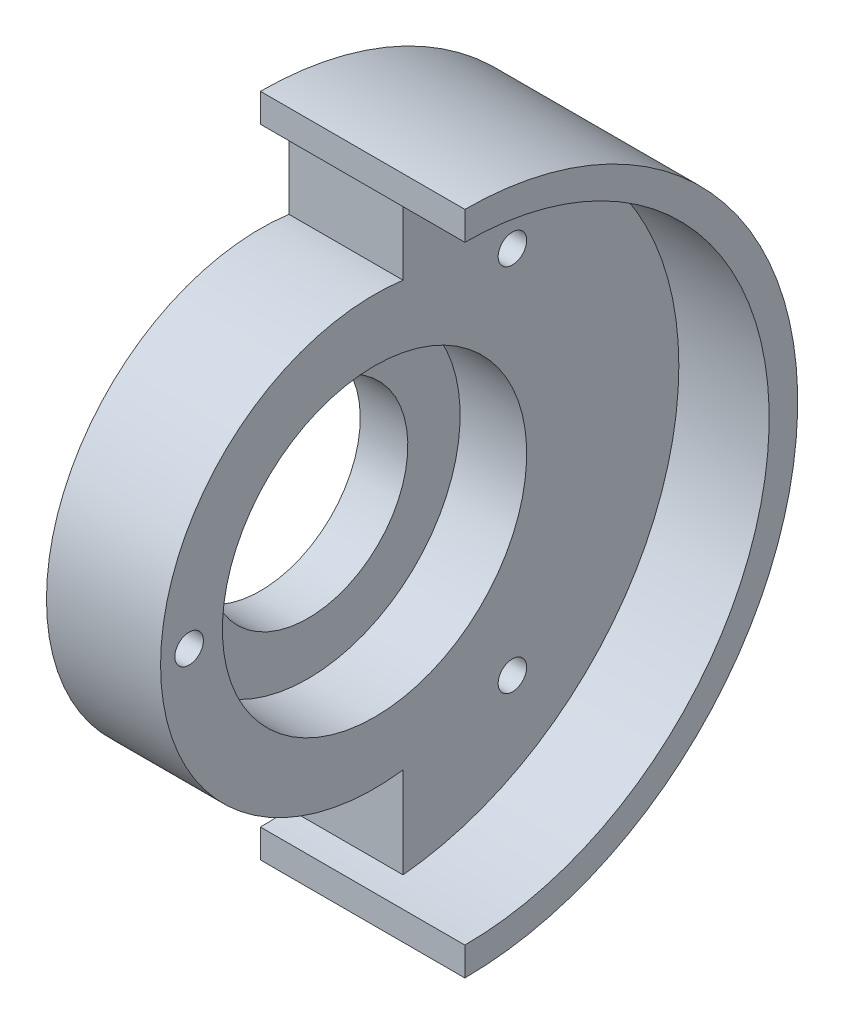
ISO-10303-21;
HEADER;
FILE_DESCRIPTION(('STEP AP214'),'2;1');
FILE_NAME('part.step','',(''),(''),'','','');
FILE_SCHEMA(('AUTOMOTIVE_DESIGN { 1 0 10303 214 1 1 1 1 }'));
ENDSEC;
DATA;
#1=APPLICATION_CONTEXT('core data for automotive mechanical design processes');
#2=APPLICATION_PROTOCOL_DEFINITION('international standard','automotive_design',2000,#1);
#3=PRODUCT_CONTEXT('',#1,'mechanical');
#4=PRODUCT('Part','Part','',(#3));
#5=PRODUCT_RELATED_PRODUCT_CATEGORY('part','',(#4));
#6=PRODUCT_DEFINITION_FORMATION('','',#4);
#7=PRODUCT_DEFINITION_CONTEXT('part definition',#1,'design');
#8=PRODUCT_DEFINITION('design','',#6,#7);
#9=PRODUCT_DEFINITION_SHAPE('','',#8);
#10=(LENGTH_UNIT() NAMED_UNIT(*) SI_UNIT(.MILLI.,.METRE.));
#11=(NAMED_UNIT(*) PLANE_ANGLE_UNIT() SI_UNIT($,.RADIAN.));
#12=(NAMED_UNIT(*) SI_UNIT($,.STERADIAN.) SOLID_ANGLE_UNIT());
#13=UNCERTAINTY_MEASURE_WITH_UNIT(LENGTH_MEASURE(1.E-05),#10,'distance_accuracy_value','');
#14=(GEOMETRIC_REPRESENTATION_CONTEXT(3) GLOBAL_UNCERTAINTY_ASSIGNED_CONTEXT((#13)) GLOBAL_UNIT_ASSIGNED_CONTEXT((#10,
#11,#12)) REPRESENTATION_CONTEXT('',''));
#15=CARTESIAN_POINT('',(0.,0.,0.));
#16=DIRECTION('',(0.,0.,1.));
#17=DIRECTION('',(1.,0.,0.));
#18=AXIS2_PLACEMENT_3D('',#15,#16,#17);
#19=CARTESIAN_POINT('',(0.,-19.437399517425,-14.5));
#20=DIRECTION('',(1.,0.,0.));
#21=DIRECTION('',(0.,1.,0.));
#22=AXIS2_PLACEMENT_3D('',#19,#20,#21);
#23=CYLINDRICAL_SURFACE('',#22,1.5);
#24=CARTESIAN_POINT('',(12.,-19.437399517425,-14.5));
#25=DIRECTION('',(1.,0.,0.));
#26=DIRECTION('',(0.,1.,0.));
#27=AXIS2_PLACEMENT_3D('',#24,#25,#26);
#28=CIRCLE('',#27,1.5);
#29=CARTESIAN_POINT('',(12.,-17.937399517425,-14.5));
#30=VERTEX_POINT('',#29);
#31=EDGE_CURVE('E153',#30,#30,#28,.T.);
#32=ORIENTED_EDGE('',*,*,#31,.T.);
#33=EDGE_LOOP('',(#32));
#34=FACE_BOUND('',#33,.T.);
#35=CARTESIAN_POINT('',(5.,-19.437399517425,-14.5));
#36=DIRECTION('',(-1.,0.,0.));
#37=DIRECTION('',(0.,-1.,0.));
#38=AXIS2_PLACEMENT_3D('',#35,#36,#37);
#39=CIRCLE('',#38,1.5);
#40=CARTESIAN_POINT('',(5.,-20.937399517425,-14.5));
#41=VERTEX_POINT('',#40);
#42=EDGE_CURVE('E39',#41,#41,#39,.F.);
#43=ORIENTED_EDGE('',*,*,#42,.F.);
#44=EDGE_LOOP('',(#43));
#45=FACE_BOUND('',#44,.T.);
#46=ADVANCED_FACE('F35',(#34,#45),#23,.F.);
#47=CARTESIAN_POINT('',(0.,0.,19.5));
#48=DIRECTION('',(1.,0.,0.));
#49=DIRECTION('',(0.,1.,0.));
#50=AXIS2_PLACEMENT_3D('',#47,#48,#49);
#51=CYLINDRICAL_SURFACE('',#50,1.5);
#52=CARTESIAN_POINT('',(12.,0.,19.5));
#53=DIRECTION('',(1.,0.,0.));
#54=DIRECTION('',(0.,1.,0.));
#55=AXIS2_PLACEMENT_3D('',#52,#53,#54);
#56=CIRCLE('',#55,1.5);
#57=CARTESIAN_POINT('',(12.,1.5,19.5));
#58=VERTEX_POINT('',#57);
#59=EDGE_CURVE('E165',#58,#58,#56,.T.);
#60=ORIENTED_EDGE('',*,*,#59,.T.);
#61=EDGE_LOOP('',(#60));
#62=FACE_BOUND('',#61,.T.);
#63=CARTESIAN_POINT('',(5.,0.,19.5));
#64=DIRECTION('',(-1.,0.,0.));
#65=DIRECTION('',(0.,-1.,0.));
#66=AXIS2_PLACEMENT_3D('',#63,#64,#65);
#67=CIRCLE('',#66,1.5);
#68=CARTESIAN_POINT('',(5.,-1.5,19.5));
#69=VERTEX_POINT('',#68);
#70=EDGE_CURVE('E129',#69,#69,#67,.F.);
#71=ORIENTED_EDGE('',*,*,#70,.F.);
#72=EDGE_LOOP('',(#71));
#73=FACE_BOUND('',#72,.T.);
#74=ADVANCED_FACE('F201',(#62,#73),#51,.F.);
#75=CARTESIAN_POINT('',(0.,19.437399517425,-14.5));
#76=DIRECTION('',(1.,0.,0.));
#77=DIRECTION('',(0.,1.,0.));
#78=AXIS2_PLACEMENT_3D('',#75,#76,#77);
#79=CYLINDRICAL_SURFACE('',#78,1.5);
#80=CARTESIAN_POINT('',(12.,19.437399517425,-14.5));
#81=DIRECTION('',(1.,0.,0.));
#82=DIRECTION('',(0.,1.,0.));
#83=AXIS2_PLACEMENT_3D('',#80,#81,#82);
#84=CIRCLE('',#83,1.5);
#85=CARTESIAN_POINT('',(12.,20.937399517425,-14.5));
#86=VERTEX_POINT('',#85);
#87=EDGE_CURVE('E173',#86,#86,#84,.T.);
#88=ORIENTED_EDGE('',*,*,#87,.T.);
#89=EDGE_LOOP('',(#88));
#90=FACE_BOUND('',#89,.T.);
#91=CARTESIAN_POINT('',(5.,19.437399517425,-14.5));
#92=DIRECTION('',(-1.,0.,0.));
#93=DIRECTION('',(0.,-1.,0.));
#94=AXIS2_PLACEMENT_3D('',#91,#92,#93);
#95=CIRCLE('',#94,1.5);
#96=CARTESIAN_POINT('',(5.,17.937399517425,-14.5));
#97=VERTEX_POINT('',#96);
#98=EDGE_CURVE('E193',#97,#97,#95,.F.);
#99=ORIENTED_EDGE('',*,*,#98,.F.);
#100=EDGE_LOOP('',(#99));
#101=FACE_BOUND('',#100,.T.);
#102=ADVANCED_FACE('F203',(#90,#101),#79,.F.);
#103=CARTESIAN_POINT('',(21.5,0.,0.));
#104=DIRECTION('',(1.,0.,0.));
#105=DIRECTION('',(0.,1.,0.));
#106=AXIS2_PLACEMENT_3D('',#103,#104,#105);
#107=CYLINDRICAL_SURFACE('',#106,35.);
#108=DIRECTION('',(1.,0.,0.));
#109=VECTOR('',#108,1.);
#110=CARTESIAN_POINT('',(0.,-35.,0.));
#111=LINE('',#110,#109);
#112=CARTESIAN_POINT('',(0.,-35.,0.));
#113=VERTEX_POINT('',#112);
#114=CARTESIAN_POINT('',(21.5,-35.,0.));
#115=VERTEX_POINT('',#114);
#116=EDGE_CURVE('E157',#113,#115,#111,.T.);
#117=ORIENTED_EDGE('',*,*,#116,.F.);
#118=CARTESIAN_POINT('',(0.,0.,0.));
#119=DIRECTION('',(1.,0.,0.));
#120=DIRECTION('',(0.,1.,0.));
#121=AXIS2_PLACEMENT_3D('',#118,#119,#120);
#122=CIRCLE('',#121,35.);
#123=CARTESIAN_POINT('',(0.,35.0000000000001,0.));
#124=VERTEX_POINT('',#123);
#125=EDGE_CURVE('E176',#113,#124,#122,.T.);
#126=ORIENTED_EDGE('',*,*,#125,.T.);
#127=DIRECTION('',(1.,0.,0.));
#128=VECTOR('',#127,1.);
#129=CARTESIAN_POINT('',(0.,35.0000000000001,0.));
#130=LINE('',#129,#128);
#131=CARTESIAN_POINT('',(21.5,35.0000000000001,0.));
#132=VERTEX_POINT('',#131);
#133=EDGE_CURVE('E119',#124,#132,#130,.T.);
#134=ORIENTED_EDGE('',*,*,#133,.T.);
#135=CARTESIAN_POINT('',(21.5,0.,0.));
#136=DIRECTION('',(1.,0.,0.));
#137=DIRECTION('',(0.,1.,0.));
#138=AXIS2_PLACEMENT_3D('',#135,#136,#137);
#139=CIRCLE('',#138,35.);
#140=EDGE_CURVE('E11',#115,#132,#139,.T.);
#141=ORIENTED_EDGE('',*,*,#140,.F.);
#142=EDGE_LOOP('',(#117,#126,#134,#141));
#143=FACE_BOUND('',#142,.T.);
#144=ADVANCED_FACE('F37',(#143),#107,.T.);
#145=CARTESIAN_POINT('',(21.5,35.,0.));
#146=DIRECTION('',(1.,0.,0.));
#147=DIRECTION('',(0.,1.,0.));
#148=AXIS2_PLACEMENT_3D('',#145,#146,#147);
#149=PLANE('',#148);
#150=DIRECTION('',(0.,1.,-1.1172740284298E-13));
#151=VECTOR('',#150,1.);
#152=CARTESIAN_POINT('',(21.5,-31.9999999999999,-3.33002771379008E-13));
#153=LINE('',#152,#151);
#154=CARTESIAN_POINT('',(21.5,-31.9999999999999,-3.33002771379008E-13));
#155=VERTEX_POINT('',#154);
#156=EDGE_CURVE('E124',#115,#155,#153,.T.);
#157=ORIENTED_EDGE('',*,*,#156,.F.);
#158=ORIENTED_EDGE('',*,*,#140,.T.);
#159=DIRECTION('',(0.,1.,0.));
#160=VECTOR('',#159,1.);
#161=CARTESIAN_POINT('',(21.5,35.0000000000001,0.));
#162=LINE('',#161,#160);
#163=CARTESIAN_POINT('',(21.5,32.0000000000001,0.));
#164=VERTEX_POINT('',#163);
#165=EDGE_CURVE('E115',#164,#132,#162,.T.);
#166=ORIENTED_EDGE('',*,*,#165,.F.);
#167=CARTESIAN_POINT('',(21.5,0.,0.));
#168=DIRECTION('',(1.,0.,0.));
#169=DIRECTION('',(0.,1.,0.));
#170=AXIS2_PLACEMENT_3D('',#167,#168,#169);
#171=CIRCLE('',#170,32.);
#172=EDGE_CURVE('E44',#155,#164,#171,.T.);
#173=ORIENTED_EDGE('',*,*,#172,.F.);
#174=EDGE_LOOP('',(#157,#158,#166,#173));
#175=FACE_BOUND('',#174,.T.);
#176=ADVANCED_FACE('F122',(#175),#149,.T.);
#177=CARTESIAN_POINT('',(21.5,0.,0.));
#178=DIRECTION('',(1.,0.,0.));
#179=DIRECTION('',(0.,1.,0.));
#180=AXIS2_PLACEMENT_3D('',#177,#178,#179);
#181=CYLINDRICAL_SURFACE('',#180,32.);
#182=DIRECTION('',(1.,0.,0.));
#183=VECTOR('',#182,1.);
#184=CARTESIAN_POINT('',(0.,32.0000000000001,0.));
#185=LINE('',#184,#183);
#186=CARTESIAN_POINT('',(0.,32.0000000000001,0.));
#187=VERTEX_POINT('',#186);
#188=EDGE_CURVE('E103',#187,#164,#185,.T.);
#189=ORIENTED_EDGE('',*,*,#188,.F.);
#190=CARTESIAN_POINT('',(0.,0.,0.));
#191=DIRECTION('',(1.,0.,0.));
#192=DIRECTION('',(0.,1.,0.));
#193=AXIS2_PLACEMENT_3D('',#190,#191,#192);
#194=CIRCLE('',#193,32.);
#195=CARTESIAN_POINT('',(0.,31.859064644148,-3.));
#196=VERTEX_POINT('',#195);
#197=EDGE_CURVE('E52',#196,#187,#194,.T.);
#198=ORIENTED_EDGE('',*,*,#197,.F.);
#199=DIRECTION('',(1.,0.,0.));
#200=VECTOR('',#199,1.);
#201=CARTESIAN_POINT('',(0.,31.859064644148,-3.));
#202=LINE('',#201,#200);
#203=CARTESIAN_POINT('',(12.,31.859064644148,-3.));
#204=VERTEX_POINT('',#203);
#205=EDGE_CURVE('E120',#196,#204,#202,.T.);
#206=ORIENTED_EDGE('',*,*,#205,.T.);
#207=CARTESIAN_POINT('',(12.,0.,0.));
#208=DIRECTION('',(1.,0.,0.));
#209=DIRECTION('',(0.,1.,0.));
#210=AXIS2_PLACEMENT_3D('',#207,#208,#209);
#211=CIRCLE('',#210,32.);
#212=CARTESIAN_POINT('',(12.,-31.8590646441479,-2.99999999999999));
#213=VERTEX_POINT('',#212);
#214=EDGE_CURVE('E111',#213,#204,#211,.T.);
#215=ORIENTED_EDGE('',*,*,#214,.F.);
#216=DIRECTION('',(1.,0.,0.));
#217=VECTOR('',#216,1.);
#218=CARTESIAN_POINT('',(0.,-31.8590646441479,-2.99999999999999));
#219=LINE('',#218,#217);
#220=CARTESIAN_POINT('',(0.,-31.8590646441479,-2.99999999999999));
#221=VERTEX_POINT('',#220);
#222=EDGE_CURVE('E154',#221,#213,#219,.T.);
#223=ORIENTED_EDGE('',*,*,#222,.F.);
#224=CARTESIAN_POINT('',(0.,0.,0.));
#225=DIRECTION('',(1.,0.,0.));
#226=DIRECTION('',(0.,1.,0.));
#227=AXIS2_PLACEMENT_3D('',#224,#225,#226);
#228=CIRCLE('',#227,32.);
#229=CARTESIAN_POINT('',(0.,-31.9999999999999,-3.33002771379008E-13));
#230=VERTEX_POINT('',#229);
#231=EDGE_CURVE('E144',#230,#221,#228,.T.);
#232=ORIENTED_EDGE('',*,*,#231,.F.);
#233=DIRECTION('',(1.,0.,0.));
#234=VECTOR('',#233,1.);
#235=CARTESIAN_POINT('',(0.,-31.9999999999999,-3.33002771379008E-13));
#236=LINE('',#235,#234);
#237=EDGE_CURVE('E106',#230,#155,#236,.T.);
#238=ORIENTED_EDGE('',*,*,#237,.T.);
#239=ORIENTED_EDGE('',*,*,#172,.T.);
#240=EDGE_LOOP('',(#189,#198,#206,#215,#223,#232,#238,#239));
#241=FACE_BOUND('',#240,.T.);
#242=ADVANCED_FACE('F102',(#241),#181,.F.);
#243=CARTESIAN_POINT('',(12.,32.,0.));
#244=DIRECTION('',(1.,0.,0.));
#245=DIRECTION('',(0.,1.,0.));
#246=AXIS2_PLACEMENT_3D('',#243,#244,#245);
#247=PLANE('',#246);
#248=ORIENTED_EDGE('',*,*,#87,.F.);
#249=EDGE_LOOP('',(#248));
#250=FACE_BOUND('',#249,.T.);
#251=DIRECTION('',(0.,1.,0.));
#252=VECTOR('',#251,1.);
#253=CARTESIAN_POINT('',(12.,32.,-2.99999999999999));
#254=LINE('',#253,#252);
#255=CARTESIAN_POINT('',(12.,-22.2991031209778,-2.99999999999999));
#256=VERTEX_POINT('',#255);
#257=EDGE_CURVE('E60',#213,#256,#254,.T.);
#258=ORIENTED_EDGE('',*,*,#257,.F.);
#259=ORIENTED_EDGE('',*,*,#214,.T.);
#260=DIRECTION('',(0.,1.,0.));
#261=VECTOR('',#260,1.);
#262=CARTESIAN_POINT('',(12.,32.,-3.));
#263=LINE('',#262,#261);
#264=CARTESIAN_POINT('',(12.,22.2991031209778,-3.));
#265=VERTEX_POINT('',#264);
#266=EDGE_CURVE('E168',#265,#204,#263,.T.);
#267=ORIENTED_EDGE('',*,*,#266,.F.);
#268=CARTESIAN_POINT('',(12.,0.,0.));
#269=DIRECTION('',(1.,0.,0.));
#270=DIRECTION('',(0.,1.,0.));
#271=AXIS2_PLACEMENT_3D('',#268,#269,#270);
#272=CIRCLE('',#271,22.5);
#273=EDGE_CURVE('E171',#256,#265,#272,.F.);
#274=ORIENTED_EDGE('',*,*,#273,.F.);
#275=EDGE_LOOP('',(#258,#259,#267,#274));
#276=FACE_BOUND('',#275,.T.);
#277=ORIENTED_EDGE('',*,*,#59,.F.);
#278=EDGE_LOOP('',(#277));
#279=FACE_BOUND('',#278,.T.);
#280=ORIENTED_EDGE('',*,*,#31,.F.);
#281=EDGE_LOOP('',(#280));
#282=FACE_BOUND('',#281,.T.);
#283=CARTESIAN_POINT('',(12.,0.,0.));
#284=DIRECTION('',(1.,0.,0.));
#285=DIRECTION('',(0.,1.,0.));
#286=AXIS2_PLACEMENT_3D('',#283,#284,#285);
#287=CIRCLE('',#286,16.);
#288=CARTESIAN_POINT('',(12.,16.,0.));
#289=VERTEX_POINT('',#288);
#290=EDGE_CURVE('E188',#289,#289,#287,.T.);
#291=ORIENTED_EDGE('',*,*,#290,.F.);
#292=EDGE_LOOP('',(#291));
#293=FACE_BOUND('',#292,.T.);
#294=ADVANCED_FACE('F251',(#250,#276,#279,#282,#293),#247,.T.);
#295=CARTESIAN_POINT('',(21.5,0.,0.));
#296=DIRECTION('',(1.,0.,0.));
#297=DIRECTION('',(0.,1.,0.));
#298=AXIS2_PLACEMENT_3D('',#295,#296,#297);
#299=CYLINDRICAL_SURFACE('',#298,16.);
#300=ORIENTED_EDGE('',*,*,#290,.T.);
#301=EDGE_LOOP('',(#300));
#302=FACE_BOUND('',#301,.T.);
#303=CARTESIAN_POINT('',(5.,0.,0.));
#304=DIRECTION('',(1.,0.,0.));
#305=DIRECTION('',(0.,1.,0.));
#306=AXIS2_PLACEMENT_3D('',#303,#304,#305);
#307=CIRCLE('',#306,16.);
#308=CARTESIAN_POINT('',(5.,16.,0.));
#309=VERTEX_POINT('',#308);
#310=EDGE_CURVE('E185',#309,#309,#307,.T.);
#311=ORIENTED_EDGE('',*,*,#310,.F.);
#312=EDGE_LOOP('',(#311));
#313=FACE_BOUND('',#312,.T.);
#314=ADVANCED_FACE('F247',(#302,#313),#299,.F.);
#315=CARTESIAN_POINT('',(5.,16.,0.));
#316=DIRECTION('',(1.,0.,0.));
#317=DIRECTION('',(0.,1.,0.));
#318=AXIS2_PLACEMENT_3D('',#315,#316,#317);
#319=PLANE('',#318);
#320=ORIENTED_EDGE('',*,*,#310,.T.);
#321=EDGE_LOOP('',(#320));
#322=FACE_BOUND('',#321,.T.);
#323=CARTESIAN_POINT('',(5.,0.,0.));
#324=DIRECTION('',(1.,0.,0.));
#325=DIRECTION('',(0.,1.,0.));
#326=AXIS2_PLACEMENT_3D('',#323,#324,#325);
#327=CIRCLE('',#326,10.5);
#328=CARTESIAN_POINT('',(5.,10.5,0.));
#329=VERTEX_POINT('',#328);
#330=EDGE_CURVE('E182',#329,#329,#327,.T.);
#331=ORIENTED_EDGE('',*,*,#330,.F.);
#332=EDGE_LOOP('',(#331));
#333=FACE_BOUND('',#332,.T.);
#334=ADVANCED_FACE('F243',(#322,#333),#319,.T.);
#335=CARTESIAN_POINT('',(21.5,0.,0.));
#336=DIRECTION('',(1.,0.,0.));
#337=DIRECTION('',(0.,1.,0.));
#338=AXIS2_PLACEMENT_3D('',#335,#336,#337);
#339=CYLINDRICAL_SURFACE('',#338,10.5);
#340=ORIENTED_EDGE('',*,*,#330,.T.);
#341=EDGE_LOOP('',(#340));
#342=FACE_BOUND('',#341,.T.);
#343=CARTESIAN_POINT('',(0.,0.,0.));
#344=DIRECTION('',(1.,0.,0.));
#345=DIRECTION('',(0.,1.,0.));
#346=AXIS2_PLACEMENT_3D('',#343,#344,#345);
#347=CIRCLE('',#346,10.5);
#348=CARTESIAN_POINT('',(0.,10.5,0.));
#349=VERTEX_POINT('',#348);
#350=EDGE_CURVE('E179',#349,#349,#347,.T.);
#351=ORIENTED_EDGE('',*,*,#350,.F.);
#352=EDGE_LOOP('',(#351));
#353=FACE_BOUND('',#352,.T.);
#354=ADVANCED_FACE('F239',(#342,#353),#339,.F.);
#355=CARTESIAN_POINT('',(0.,10.5,0.));
#356=DIRECTION('',(-1.,0.,0.));
#357=DIRECTION('',(0.,-1.,0.));
#358=AXIS2_PLACEMENT_3D('',#355,#356,#357);
#359=PLANE('',#358);
#360=CARTESIAN_POINT('',(0.,19.437399517425,-14.5));
#361=DIRECTION('',(-1.,0.,0.));
#362=DIRECTION('',(0.,-1.,0.));
#363=AXIS2_PLACEMENT_3D('',#360,#361,#362);
#364=CIRCLE('',#363,2.75);
#365=CARTESIAN_POINT('',(0.,16.687399517425,-14.5));
#366=VERTEX_POINT('',#365);
#367=EDGE_CURVE('E319',#366,#366,#364,.T.);
#368=ORIENTED_EDGE('',*,*,#367,.F.);
#369=EDGE_LOOP('',(#368));
#370=FACE_BOUND('',#369,.T.);
#371=CARTESIAN_POINT('',(0.,0.,19.5));
#372=DIRECTION('',(-1.,0.,0.));
#373=DIRECTION('',(0.,-1.,0.));
#374=AXIS2_PLACEMENT_3D('',#371,#372,#373);
#375=CIRCLE('',#374,2.75);
#376=CARTESIAN_POINT('',(0.,-2.75,19.5));
#377=VERTEX_POINT('',#376);
#378=EDGE_CURVE('E327',#377,#377,#375,.T.);
#379=ORIENTED_EDGE('',*,*,#378,.F.);
#380=EDGE_LOOP('',(#379));
#381=FACE_BOUND('',#380,.T.);
#382=CARTESIAN_POINT('',(0.,-19.437399517425,-14.5));
#383=DIRECTION('',(-1.,0.,0.));
#384=DIRECTION('',(0.,-1.,0.));
#385=AXIS2_PLACEMENT_3D('',#382,#383,#384);
#386=CIRCLE('',#385,2.75);
#387=CARTESIAN_POINT('',(0.,-22.187399517425,-14.5));
#388=VERTEX_POINT('',#387);
#389=EDGE_CURVE('E131',#388,#388,#386,.T.);
#390=ORIENTED_EDGE('',*,*,#389,.F.);
#391=EDGE_LOOP('',(#390));
#392=FACE_BOUND('',#391,.T.);
#393=DIRECTION('',(0.,1.,-1.1172740284298E-13));
#394=VECTOR('',#393,1.);
#395=CARTESIAN_POINT('',(0.,-31.9999999999999,-3.33002771379008E-13));
#396=LINE('',#395,#394);
#397=EDGE_CURVE('E141',#113,#230,#396,.T.);
#398=ORIENTED_EDGE('',*,*,#397,.T.);
#399=ORIENTED_EDGE('',*,*,#231,.T.);
#400=DIRECTION('',(0.,1.,0.));
#401=VECTOR('',#400,1.);
#402=CARTESIAN_POINT('',(0.,-22.2991031209778,-2.99999999999999));
#403=LINE('',#402,#401);
#404=CARTESIAN_POINT('',(0.,-22.2991031209778,-2.99999999999999));
#405=VERTEX_POINT('',#404);
#406=EDGE_CURVE('E147',#221,#405,#403,.T.);
#407=ORIENTED_EDGE('',*,*,#406,.T.);
#408=CARTESIAN_POINT('',(0.,0.,0.));
#409=DIRECTION('',(-1.,0.,0.));
#410=DIRECTION('',(0.,1.,0.));
#411=AXIS2_PLACEMENT_3D('',#408,#409,#410);
#412=CIRCLE('',#411,22.5);
#413=CARTESIAN_POINT('',(0.,22.2991031209778,-3.));
#414=VERTEX_POINT('',#413);
#415=EDGE_CURVE('E126',#405,#414,#412,.T.);
#416=ORIENTED_EDGE('',*,*,#415,.T.);
#417=DIRECTION('',(0.,1.,0.));
#418=VECTOR('',#417,1.);
#419=CARTESIAN_POINT('',(0.,22.2991031209778,-3.));
#420=LINE('',#419,#418);
#421=EDGE_CURVE('E136',#414,#196,#420,.T.);
#422=ORIENTED_EDGE('',*,*,#421,.T.);
#423=ORIENTED_EDGE('',*,*,#197,.T.);
#424=DIRECTION('',(0.,1.,0.));
#425=VECTOR('',#424,1.);
#426=CARTESIAN_POINT('',(0.,35.0000000000001,0.));
#427=LINE('',#426,#425);
#428=EDGE_CURVE('E118',#187,#124,#427,.T.);
#429=ORIENTED_EDGE('',*,*,#428,.T.);
#430=ORIENTED_EDGE('',*,*,#125,.F.);
#431=EDGE_LOOP('',(#398,#399,#407,#416,#422,#423,#429,#430));
#432=FACE_BOUND('',#431,.T.);
#433=ORIENTED_EDGE('',*,*,#350,.T.);
#434=EDGE_LOOP('',(#433));
#435=FACE_BOUND('',#434,.T.);
#436=ADVANCED_FACE('F234',(#370,#381,#392,#432,#435),#359,.T.);
#437=CARTESIAN_POINT('',(0.,0.,0.));
#438=DIRECTION('',(1.,0.,0.));
#439=DIRECTION('',(0.,1.,0.));
#440=AXIS2_PLACEMENT_3D('',#437,#438,#439);
#441=CYLINDRICAL_SURFACE('',#440,22.5);
#442=ORIENTED_EDGE('',*,*,#273,.T.);
#443=DIRECTION('',(1.,0.,0.));
#444=VECTOR('',#443,1.);
#445=CARTESIAN_POINT('',(0.,22.2991031209778,-3.));
#446=LINE('',#445,#444);
#447=EDGE_CURVE('E150',#414,#265,#446,.T.);
#448=ORIENTED_EDGE('',*,*,#447,.F.);
#449=ORIENTED_EDGE('',*,*,#415,.F.);
#450=DIRECTION('',(1.,0.,0.));
#451=VECTOR('',#450,1.);
#452=CARTESIAN_POINT('',(0.,-22.2991031209778,-2.99999999999999));
#453=LINE('',#452,#451);
#454=EDGE_CURVE('E151',#405,#256,#453,.T.);
#455=ORIENTED_EDGE('',*,*,#454,.T.);
#456=EDGE_LOOP('',(#442,#448,#449,#455));
#457=FACE_BOUND('',#456,.T.);
#458=ADVANCED_FACE('F222',(#457),#441,.T.);
#459=CARTESIAN_POINT('',(0.,-22.2991031209778,-2.99999999999999));
#460=DIRECTION('',(0.,0.,-1.));
#461=DIRECTION('',(-1.,0.,0.));
#462=AXIS2_PLACEMENT_3D('',#459,#460,#461);
#463=PLANE('',#462);
#464=ORIENTED_EDGE('',*,*,#257,.T.);
#465=ORIENTED_EDGE('',*,*,#454,.F.);
#466=ORIENTED_EDGE('',*,*,#406,.F.);
#467=ORIENTED_EDGE('',*,*,#222,.T.);
#468=EDGE_LOOP('',(#464,#465,#466,#467));
#469=FACE_BOUND('',#468,.T.);
#470=ADVANCED_FACE('F218',(#469),#463,.F.);
#471=CARTESIAN_POINT('',(0.,-31.9999999999999,-3.33002771379008E-13));
#472=DIRECTION('',(0.,-1.1172740284298E-13,-1.));
#473=DIRECTION('',(0.,1.,-1.1172740284298E-13));
#474=AXIS2_PLACEMENT_3D('',#471,#472,#473);
#475=PLANE('',#474);
#476=ORIENTED_EDGE('',*,*,#237,.F.);
#477=ORIENTED_EDGE('',*,*,#397,.F.);
#478=ORIENTED_EDGE('',*,*,#116,.T.);
#479=ORIENTED_EDGE('',*,*,#156,.T.);
#480=EDGE_LOOP('',(#476,#477,#478,#479));
#481=FACE_BOUND('',#480,.T.);
#482=ADVANCED_FACE('F221',(#481),#475,.F.);
#483=CARTESIAN_POINT('',(0.,35.0000000000001,0.));
#484=DIRECTION('',(0.,0.,-1.));
#485=DIRECTION('',(0.,1.,0.));
#486=AXIS2_PLACEMENT_3D('',#483,#484,#485);
#487=PLANE('',#486);
#488=ORIENTED_EDGE('',*,*,#133,.F.);
#489=ORIENTED_EDGE('',*,*,#428,.F.);
#490=ORIENTED_EDGE('',*,*,#188,.T.);
#491=ORIENTED_EDGE('',*,*,#165,.T.);
#492=EDGE_LOOP('',(#488,#489,#490,#491));
#493=FACE_BOUND('',#492,.T.);
#494=ADVANCED_FACE('F114',(#493),#487,.F.);
#495=CARTESIAN_POINT('',(0.,22.2991031209778,-3.));
#496=DIRECTION('',(0.,0.,-1.));
#497=DIRECTION('',(-1.,0.,0.));
#498=AXIS2_PLACEMENT_3D('',#495,#496,#497);
#499=PLANE('',#498);
#500=ORIENTED_EDGE('',*,*,#266,.T.);
#501=ORIENTED_EDGE('',*,*,#205,.F.);
#502=ORIENTED_EDGE('',*,*,#421,.F.);
#503=ORIENTED_EDGE('',*,*,#447,.T.);
#504=EDGE_LOOP('',(#500,#501,#502,#503));
#505=FACE_BOUND('',#504,.T.);
#506=ADVANCED_FACE('F228',(#505),#499,.F.);
#507=CARTESIAN_POINT('',(5.,19.437399517425,-14.5));
#508=DIRECTION('',(-1.,0.,0.));
#509=DIRECTION('',(0.,-1.,0.));
#510=AXIS2_PLACEMENT_3D('',#507,#508,#509);
#511=PLANE('',#510);
#512=CARTESIAN_POINT('',(5.,19.437399517425,-14.5));
#513=DIRECTION('',(-1.,0.,0.));
#514=DIRECTION('',(0.,-1.,0.));
#515=AXIS2_PLACEMENT_3D('',#512,#513,#514);
#516=CIRCLE('',#515,2.75);
#517=CARTESIAN_POINT('',(5.,16.687399517425,-14.5));
#518=VERTEX_POINT('',#517);
#519=EDGE_CURVE('E195',#518,#518,#516,.T.);
#520=ORIENTED_EDGE('',*,*,#519,.T.);
#521=EDGE_LOOP('',(#520));
#522=FACE_BOUND('',#521,.T.);
#523=ORIENTED_EDGE('',*,*,#98,.T.);
#524=EDGE_LOOP('',(#523));
#525=FACE_BOUND('',#524,.T.);
#526=ADVANCED_FACE('F231',(#522,#525),#511,.T.);
#527=CARTESIAN_POINT('',(5.,19.437399517425,-14.5));
#528=DIRECTION('',(-1.,0.,0.));
#529=DIRECTION('',(0.,-1.,0.));
#530=AXIS2_PLACEMENT_3D('',#527,#528,#529);
#531=CYLINDRICAL_SURFACE('',#530,2.75);
#532=ORIENTED_EDGE('',*,*,#519,.F.);
#533=EDGE_LOOP('',(#532));
#534=FACE_BOUND('',#533,.T.);
#535=ORIENTED_EDGE('',*,*,#367,.T.);
#536=EDGE_LOOP('',(#535));
#537=FACE_BOUND('',#536,.T.);
#538=ADVANCED_FACE('F305',(#534,#537),#531,.F.);
#539=CARTESIAN_POINT('',(5.,0.,19.5));
#540=DIRECTION('',(-1.,0.,0.));
#541=DIRECTION('',(0.,-1.,0.));
#542=AXIS2_PLACEMENT_3D('',#539,#540,#541);
#543=PLANE('',#542);
#544=CARTESIAN_POINT('',(5.,0.,19.5));
#545=DIRECTION('',(-1.,0.,0.));
#546=DIRECTION('',(0.,-1.,0.));
#547=AXIS2_PLACEMENT_3D('',#544,#545,#546);
#548=CIRCLE('',#547,2.75);
#549=CARTESIAN_POINT('',(5.,-2.75,19.5));
#550=VERTEX_POINT('',#549);
#551=EDGE_CURVE('E322',#550,#550,#548,.T.);
#552=ORIENTED_EDGE('',*,*,#551,.T.);
#553=EDGE_LOOP('',(#552));
#554=FACE_BOUND('',#553,.T.);
#555=ORIENTED_EDGE('',*,*,#70,.T.);
#556=EDGE_LOOP('',(#555));
#557=FACE_BOUND('',#556,.T.);
#558=ADVANCED_FACE('F199',(#554,#557),#543,.T.);
#559=CARTESIAN_POINT('',(5.,0.,19.5));
#560=DIRECTION('',(-1.,0.,0.));
#561=DIRECTION('',(0.,-1.,0.));
#562=AXIS2_PLACEMENT_3D('',#559,#560,#561);
#563=CYLINDRICAL_SURFACE('',#562,2.75);
#564=ORIENTED_EDGE('',*,*,#551,.F.);
#565=EDGE_LOOP('',(#564));
#566=FACE_BOUND('',#565,.T.);
#567=ORIENTED_EDGE('',*,*,#378,.T.);
#568=EDGE_LOOP('',(#567));
#569=FACE_BOUND('',#568,.T.);
#570=ADVANCED_FACE('F292',(#566,#569),#563,.F.);
#571=CARTESIAN_POINT('',(5.,-19.437399517425,-14.5));
#572=DIRECTION('',(-1.,0.,0.));
#573=DIRECTION('',(0.,-1.,0.));
#574=AXIS2_PLACEMENT_3D('',#571,#572,#573);
#575=PLANE('',#574);
#576=CARTESIAN_POINT('',(5.,-19.437399517425,-14.5));
#577=DIRECTION('',(-1.,0.,0.));
#578=DIRECTION('',(0.,-1.,0.));
#579=AXIS2_PLACEMENT_3D('',#576,#577,#578);
#580=CIRCLE('',#579,2.75);
#581=CARTESIAN_POINT('',(5.,-22.187399517425,-14.5));
#582=VERTEX_POINT('',#581);
#583=EDGE_CURVE('E329',#582,#582,#580,.T.);
#584=ORIENTED_EDGE('',*,*,#583,.T.);
#585=EDGE_LOOP('',(#584));
#586=FACE_BOUND('',#585,.T.);
#587=ORIENTED_EDGE('',*,*,#42,.T.);
#588=EDGE_LOOP('',(#587));
#589=FACE_BOUND('',#588,.T.);
#590=ADVANCED_FACE('F290',(#586,#589),#575,.T.);
#591=CARTESIAN_POINT('',(5.,-19.437399517425,-14.5));
#592=DIRECTION('',(-1.,0.,0.));
#593=DIRECTION('',(0.,-1.,0.));
#594=AXIS2_PLACEMENT_3D('',#591,#592,#593);
#595=CYLINDRICAL_SURFACE('',#594,2.75);
#596=ORIENTED_EDGE('',*,*,#583,.F.);
#597=EDGE_LOOP('',(#596));
#598=FACE_BOUND('',#597,.T.);
#599=ORIENTED_EDGE('',*,*,#389,.T.);
#600=EDGE_LOOP('',(#599));
#601=FACE_BOUND('',#600,.T.);
#602=ADVANCED_FACE('F216',(#598,#601),#595,.F.);
#603=CLOSED_SHELL('',(#46,#74,#102,#144,#176,#242,#294,#314,#334,#354,#436,#458,#470,#482,#494,
#506,#526,#538,#558,#570,#590,#602));
#604=MANIFOLD_SOLID_BREP('B2',#603);
#605=ADVANCED_BREP_SHAPE_REPRESENTATION('',(#18,#604),#14);
#606=SHAPE_DEFINITION_REPRESENTATION(#9,#605);
ENDSEC;
END-ISO-10303-21;
